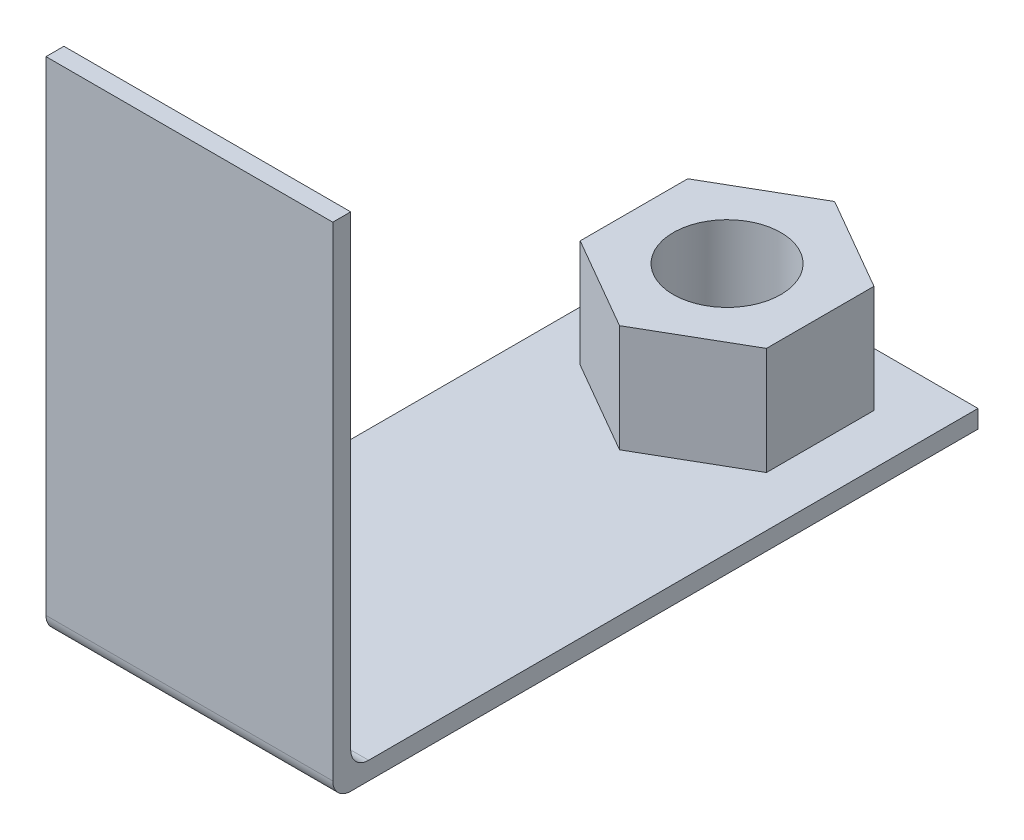
ISO-10303-21;
HEADER;
FILE_DESCRIPTION(('STEP AP214'),'2;1');
FILE_NAME('part.step','',(''),(''),'','','');
FILE_SCHEMA(('AUTOMOTIVE_DESIGN { 1 0 10303 214 1 1 1 1 }'));
ENDSEC;
DATA;
#1=APPLICATION_CONTEXT('core data for automotive mechanical design processes');
#2=APPLICATION_PROTOCOL_DEFINITION('international standard','automotive_design',2000,#1);
#3=PRODUCT_CONTEXT('',#1,'mechanical');
#4=PRODUCT('Part','Part','',(#3));
#5=PRODUCT_RELATED_PRODUCT_CATEGORY('part','',(#4));
#6=PRODUCT_DEFINITION_FORMATION('','',#4);
#7=PRODUCT_DEFINITION_CONTEXT('part definition',#1,'design');
#8=PRODUCT_DEFINITION('design','',#6,#7);
#9=PRODUCT_DEFINITION_SHAPE('','',#8);
#10=(LENGTH_UNIT() NAMED_UNIT(*) SI_UNIT(.MILLI.,.METRE.));
#11=(NAMED_UNIT(*) PLANE_ANGLE_UNIT() SI_UNIT($,.RADIAN.));
#12=(NAMED_UNIT(*) SI_UNIT($,.STERADIAN.) SOLID_ANGLE_UNIT());
#13=UNCERTAINTY_MEASURE_WITH_UNIT(LENGTH_MEASURE(1.E-05),#10,'distance_accuracy_value','');
#14=(GEOMETRIC_REPRESENTATION_CONTEXT(3) GLOBAL_UNCERTAINTY_ASSIGNED_CONTEXT((#13)) GLOBAL_UNIT_ASSIGNED_CONTEXT((#10,
#11,#12)) REPRESENTATION_CONTEXT('',''));
#15=CARTESIAN_POINT('',(0.,0.,0.));
#16=DIRECTION('',(0.,0.,1.));
#17=DIRECTION('',(1.,0.,0.));
#18=AXIS2_PLACEMENT_3D('',#15,#16,#17);
#19=CARTESIAN_POINT('',(4.,14.,-0.499999999999999));
#20=DIRECTION('',(0.,0.,1.));
#21=DIRECTION('',(1.,0.,0.));
#22=AXIS2_PLACEMENT_3D('',#19,#20,#21);
#23=PLANE('',#22);
#24=DIRECTION('',(0.,-1.,0.));
#25=VECTOR('',#24,1.);
#26=CARTESIAN_POINT('',(4.,14.,-0.499999999999999));
#27=LINE('',#26,#25);
#28=CARTESIAN_POINT('',(4.,14.,-0.499999999999999));
#29=VERTEX_POINT('',#28);
#30=CARTESIAN_POINT('',(4.,0.999999999999999,-0.499999999999999));
#31=VERTEX_POINT('',#30);
#32=EDGE_CURVE('E178',#29,#31,#27,.T.);
#33=ORIENTED_EDGE('',*,*,#32,.T.);
#34=DIRECTION('',(-1.,0.,0.));
#35=VECTOR('',#34,1.);
#36=CARTESIAN_POINT('',(-4.,0.999999999999999,-0.499999999999999));
#37=LINE('',#36,#35);
#38=CARTESIAN_POINT('',(-4.,0.999999999999999,-0.499999999999999));
#39=VERTEX_POINT('',#38);
#40=EDGE_CURVE('E217',#31,#39,#37,.T.);
#41=ORIENTED_EDGE('',*,*,#40,.T.);
#42=DIRECTION('',(0.,-1.,0.));
#43=VECTOR('',#42,1.);
#44=CARTESIAN_POINT('',(-4.,14.,-0.499999999999999));
#45=LINE('',#44,#43);
#46=CARTESIAN_POINT('',(-4.,14.,-0.499999999999999));
#47=VERTEX_POINT('',#46);
#48=EDGE_CURVE('E176',#47,#39,#45,.T.);
#49=ORIENTED_EDGE('',*,*,#48,.F.);
#50=DIRECTION('',(-1.,0.,0.));
#51=VECTOR('',#50,1.);
#52=CARTESIAN_POINT('',(4.,14.,-0.499999999999999));
#53=LINE('',#52,#51);
#54=EDGE_CURVE('E171',#29,#47,#53,.T.);
#55=ORIENTED_EDGE('',*,*,#54,.F.);
#56=EDGE_LOOP('',(#33,#41,#49,#55));
#57=FACE_BOUND('',#56,.T.);
#58=CARTESIAN_POINT('',(0.,10.3412824624263,-0.499999999999999));
#59=DIRECTION('',(0.,0.,1.));
#60=DIRECTION('',(1.,0.,0.));
#61=AXIS2_PLACEMENT_3D('',#58,#59,#60);
#62=CIRCLE('',#61,2.83837180414042);
#63=CARTESIAN_POINT('',(2.83837180414042,10.3412824624263,-0.499999999999999));
#64=VERTEX_POINT('',#63);
#65=EDGE_CURVE('E11',#64,#64,#62,.F.);
#66=ORIENTED_EDGE('',*,*,#65,.F.);
#67=EDGE_LOOP('',(#66));
#68=FACE_BOUND('',#67,.T.);
#69=ADVANCED_FACE('F34',(#57,#68),#23,.F.);
#70=CARTESIAN_POINT('',(0.,0.5,0.));
#71=DIRECTION('',(0.,-1.,0.));
#72=DIRECTION('',(0.,0.,-1.));
#73=AXIS2_PLACEMENT_3D('',#70,#71,#72);
#74=PLANE('',#73);
#75=DIRECTION('',(0.,0.,1.));
#76=VECTOR('',#75,1.);
#77=CARTESIAN_POINT('',(-4.,0.5,0.));
#78=LINE('',#77,#76);
#79=CARTESIAN_POINT('',(-4.,0.5,-18.));
#80=VERTEX_POINT('',#79);
#81=CARTESIAN_POINT('',(-4.,0.5,-1.));
#82=VERTEX_POINT('',#81);
#83=EDGE_CURVE('E189',#80,#82,#78,.T.);
#84=ORIENTED_EDGE('',*,*,#83,.T.);
#85=DIRECTION('',(-1.,0.,0.));
#86=VECTOR('',#85,1.);
#87=CARTESIAN_POINT('',(4.,0.5,-1.));
#88=LINE('',#87,#86);
#89=CARTESIAN_POINT('',(4.,0.5,-1.));
#90=VERTEX_POINT('',#89);
#91=EDGE_CURVE('E49',#82,#90,#88,.F.);
#92=ORIENTED_EDGE('',*,*,#91,.T.);
#93=DIRECTION('',(0.,0.,-1.));
#94=VECTOR('',#93,1.);
#95=CARTESIAN_POINT('',(4.,0.5,-18.));
#96=LINE('',#95,#94);
#97=CARTESIAN_POINT('',(4.,0.5,-18.));
#98=VERTEX_POINT('',#97);
#99=EDGE_CURVE('E182',#90,#98,#96,.T.);
#100=ORIENTED_EDGE('',*,*,#99,.T.);
#101=DIRECTION('',(-1.,0.,0.));
#102=VECTOR('',#101,1.);
#103=CARTESIAN_POINT('',(-4.,0.5,-18.));
#104=LINE('',#103,#102);
#105=CARTESIAN_POINT('',(0.,0.5,-18.));
#106=VERTEX_POINT('',#105);
#107=EDGE_CURVE('E186',#98,#106,#104,.T.);
#108=ORIENTED_EDGE('',*,*,#107,.T.);
#109=DIRECTION('',(-0.866025403784441,0.,-0.499999999999995));
#110=VECTOR('',#109,1.);
#111=CARTESIAN_POINT('',(2.5980762113533,0.5,-16.5));
#112=LINE('',#111,#110);
#113=CARTESIAN_POINT('',(2.5980762113533,0.5,-16.5));
#114=VERTEX_POINT('',#113);
#115=EDGE_CURVE('E160',#114,#106,#112,.T.);
#116=ORIENTED_EDGE('',*,*,#115,.F.);
#117=DIRECTION('',(0.,0.,-1.));
#118=VECTOR('',#117,1.);
#119=CARTESIAN_POINT('',(2.59807621135333,0.5,-13.5));
#120=LINE('',#119,#118);
#121=CARTESIAN_POINT('',(2.59807621135333,0.5,-13.5));
#122=VERTEX_POINT('',#121);
#123=EDGE_CURVE('E157',#122,#114,#120,.T.);
#124=ORIENTED_EDGE('',*,*,#123,.F.);
#125=DIRECTION('',(0.866025403784434,0.,-0.500000000000007));
#126=VECTOR('',#125,1.);
#127=CARTESIAN_POINT('',(0.,0.5,-12.));
#128=LINE('',#127,#126);
#129=CARTESIAN_POINT('',(0.,0.5,-12.));
#130=VERTEX_POINT('',#129);
#131=EDGE_CURVE('E457',#130,#122,#128,.T.);
#132=ORIENTED_EDGE('',*,*,#131,.F.);
#133=DIRECTION('',(0.866025403784442,0.,0.499999999999995));
#134=VECTOR('',#133,1.);
#135=CARTESIAN_POINT('',(-2.59807621135331,0.5,-13.5));
#136=LINE('',#135,#134);
#137=CARTESIAN_POINT('',(-2.59807621135331,0.5,-13.5));
#138=VERTEX_POINT('',#137);
#139=EDGE_CURVE('E454',#138,#130,#136,.T.);
#140=ORIENTED_EDGE('',*,*,#139,.F.);
#141=DIRECTION('',(0.,0.,1.));
#142=VECTOR('',#141,1.);
#143=CARTESIAN_POINT('',(-2.59807621135332,0.5,-16.5));
#144=LINE('',#143,#142);
#145=CARTESIAN_POINT('',(-2.59807621135332,0.5,-16.5));
#146=VERTEX_POINT('',#145);
#147=EDGE_CURVE('E451',#146,#138,#144,.T.);
#148=ORIENTED_EDGE('',*,*,#147,.F.);
#149=DIRECTION('',(-0.866025403784438,0.,0.500000000000001));
#150=VECTOR('',#149,1.);
#151=CARTESIAN_POINT('',(0.,0.5,-18.));
#152=LINE('',#151,#150);
#153=EDGE_CURVE('E449',#106,#146,#152,.T.);
#154=ORIENTED_EDGE('',*,*,#153,.F.);
#155=EDGE_CURVE('E184',#106,#80,#104,.T.);
#156=ORIENTED_EDGE('',*,*,#155,.T.);
#157=EDGE_LOOP('',(#84,#92,#100,#108,#116,#124,#132,#140,#148,#154,#156));
#158=FACE_BOUND('',#157,.T.);
#159=ADVANCED_FACE('F246',(#158),#74,.F.);
#160=CARTESIAN_POINT('',(4.,0.5,-18.));
#161=DIRECTION('',(-1.,0.,0.));
#162=DIRECTION('',(0.,0.,1.));
#163=AXIS2_PLACEMENT_3D('',#160,#161,#162);
#164=PLANE('',#163);
#165=DIRECTION('',(0.,-1.,0.));
#166=VECTOR('',#165,1.);
#167=CARTESIAN_POINT('',(4.,0.5,0.));
#168=LINE('',#167,#166);
#169=CARTESIAN_POINT('',(4.,14.,0.));
#170=VERTEX_POINT('',#169);
#171=CARTESIAN_POINT('',(4.,0.5,0.));
#172=VERTEX_POINT('',#171);
#173=EDGE_CURVE('E205',#170,#172,#168,.T.);
#174=ORIENTED_EDGE('',*,*,#173,.T.);
#175=CARTESIAN_POINT('',(4.,0.5,-0.500000000000001));
#176=DIRECTION('',(-1.,0.,0.));
#177=DIRECTION('',(0.,0.,1.));
#178=AXIS2_PLACEMENT_3D('',#175,#176,#177);
#179=CIRCLE('',#178,0.5);
#180=CARTESIAN_POINT('',(4.,0.,-0.5));
#181=VERTEX_POINT('',#180);
#182=EDGE_CURVE('E211',#172,#181,#179,.F.);
#183=ORIENTED_EDGE('',*,*,#182,.T.);
#184=DIRECTION('',(0.,0.,-1.));
#185=VECTOR('',#184,1.);
#186=CARTESIAN_POINT('',(4.,0.,-18.));
#187=LINE('',#186,#185);
#188=CARTESIAN_POINT('',(4.,0.,-18.));
#189=VERTEX_POINT('',#188);
#190=EDGE_CURVE('E181',#181,#189,#187,.T.);
#191=ORIENTED_EDGE('',*,*,#190,.T.);
#192=DIRECTION('',(0.,-1.,0.));
#193=VECTOR('',#192,1.);
#194=CARTESIAN_POINT('',(4.,0.5,-18.));
#195=LINE('',#194,#193);
#196=EDGE_CURVE('E202',#98,#189,#195,.T.);
#197=ORIENTED_EDGE('',*,*,#196,.F.);
#198=ORIENTED_EDGE('',*,*,#99,.F.);
#199=CARTESIAN_POINT('',(4.,0.999999999999999,-1.));
#200=DIRECTION('',(-1.,0.,0.));
#201=DIRECTION('',(0.,0.,1.));
#202=AXIS2_PLACEMENT_3D('',#199,#200,#201);
#203=CIRCLE('',#202,0.5);
#204=EDGE_CURVE('E42',#90,#31,#203,.T.);
#205=ORIENTED_EDGE('',*,*,#204,.T.);
#206=ORIENTED_EDGE('',*,*,#32,.F.);
#207=DIRECTION('',(0.,0.,-1.));
#208=VECTOR('',#207,1.);
#209=CARTESIAN_POINT('',(4.,14.,0.));
#210=LINE('',#209,#208);
#211=EDGE_CURVE('E164',#170,#29,#210,.T.);
#212=ORIENTED_EDGE('',*,*,#211,.F.);
#213=EDGE_LOOP('',(#174,#183,#191,#197,#198,#205,#206,#212));
#214=FACE_BOUND('',#213,.T.);
#215=ADVANCED_FACE('F224',(#214),#164,.F.);
#216=CARTESIAN_POINT('',(-4.,0.5,-18.));
#217=DIRECTION('',(0.,0.,1.));
#218=DIRECTION('',(1.,0.,0.));
#219=AXIS2_PLACEMENT_3D('',#216,#217,#218);
#220=PLANE('',#219);
#221=DIRECTION('',(-1.,0.,0.));
#222=VECTOR('',#221,1.);
#223=CARTESIAN_POINT('',(-4.,0.,-18.));
#224=LINE('',#223,#222);
#225=CARTESIAN_POINT('',(-4.,0.,-18.));
#226=VERTEX_POINT('',#225);
#227=EDGE_CURVE('E193',#189,#226,#224,.T.);
#228=ORIENTED_EDGE('',*,*,#227,.T.);
#229=DIRECTION('',(0.,-1.,0.));
#230=VECTOR('',#229,1.);
#231=CARTESIAN_POINT('',(-4.,0.5,-18.));
#232=LINE('',#231,#230);
#233=EDGE_CURVE('E199',#80,#226,#232,.T.);
#234=ORIENTED_EDGE('',*,*,#233,.F.);
#235=ORIENTED_EDGE('',*,*,#155,.F.);
#236=ORIENTED_EDGE('',*,*,#107,.F.);
#237=ORIENTED_EDGE('',*,*,#196,.T.);
#238=EDGE_LOOP('',(#228,#234,#235,#236,#237));
#239=FACE_BOUND('',#238,.T.);
#240=ADVANCED_FACE('F267',(#239),#220,.F.);
#241=CARTESIAN_POINT('',(-4.,0.5,0.));
#242=DIRECTION('',(1.,0.,0.));
#243=DIRECTION('',(0.,0.,-1.));
#244=AXIS2_PLACEMENT_3D('',#241,#242,#243);
#245=PLANE('',#244);
#246=DIRECTION('',(0.,0.,1.));
#247=VECTOR('',#246,1.);
#248=CARTESIAN_POINT('',(-4.,0.,0.));
#249=LINE('',#248,#247);
#250=CARTESIAN_POINT('',(-4.,0.,-0.499999999999999));
#251=VERTEX_POINT('',#250);
#252=EDGE_CURVE('E185',#226,#251,#249,.T.);
#253=ORIENTED_EDGE('',*,*,#252,.T.);
#254=CARTESIAN_POINT('',(-4.,0.5,-0.499999999999999));
#255=DIRECTION('',(1.,0.,0.));
#256=DIRECTION('',(0.,0.,-1.));
#257=AXIS2_PLACEMENT_3D('',#254,#255,#256);
#258=CIRCLE('',#257,0.5);
#259=CARTESIAN_POINT('',(-4.,0.5,0.));
#260=VERTEX_POINT('',#259);
#261=EDGE_CURVE('E215',#251,#260,#258,.F.);
#262=ORIENTED_EDGE('',*,*,#261,.T.);
#263=DIRECTION('',(0.,-1.,0.));
#264=VECTOR('',#263,1.);
#265=CARTESIAN_POINT('',(-4.,0.5,0.));
#266=LINE('',#265,#264);
#267=CARTESIAN_POINT('',(-4.,14.,0.));
#268=VERTEX_POINT('',#267);
#269=EDGE_CURVE('E191',#268,#260,#266,.T.);
#270=ORIENTED_EDGE('',*,*,#269,.F.);
#271=DIRECTION('',(0.,0.,1.));
#272=VECTOR('',#271,1.);
#273=CARTESIAN_POINT('',(-4.,14.,0.));
#274=LINE('',#273,#272);
#275=EDGE_CURVE('E173',#47,#268,#274,.T.);
#276=ORIENTED_EDGE('',*,*,#275,.F.);
#277=ORIENTED_EDGE('',*,*,#48,.T.);
#278=CARTESIAN_POINT('',(-4.,0.999999999999999,-1.));
#279=DIRECTION('',(1.,0.,0.));
#280=DIRECTION('',(0.,0.,-1.));
#281=AXIS2_PLACEMENT_3D('',#278,#279,#280);
#282=CIRCLE('',#281,0.5);
#283=EDGE_CURVE('E57',#39,#82,#282,.T.);
#284=ORIENTED_EDGE('',*,*,#283,.T.);
#285=ORIENTED_EDGE('',*,*,#83,.F.);
#286=ORIENTED_EDGE('',*,*,#233,.T.);
#287=EDGE_LOOP('',(#253,#262,#270,#276,#277,#284,#285,#286));
#288=FACE_BOUND('',#287,.T.);
#289=ADVANCED_FACE('F263',(#288),#245,.F.);
#290=CARTESIAN_POINT('',(0.,0.5,0.));
#291=DIRECTION('',(0.,0.,-1.));
#292=DIRECTION('',(-1.,0.,0.));
#293=AXIS2_PLACEMENT_3D('',#290,#291,#292);
#294=PLANE('',#293);
#295=ORIENTED_EDGE('',*,*,#269,.T.);
#296=DIRECTION('',(1.,0.,0.));
#297=VECTOR('',#296,1.);
#298=CARTESIAN_POINT('',(4.,0.5,0.));
#299=LINE('',#298,#297);
#300=EDGE_CURVE('E208',#260,#172,#299,.T.);
#301=ORIENTED_EDGE('',*,*,#300,.T.);
#302=ORIENTED_EDGE('',*,*,#173,.F.);
#303=DIRECTION('',(1.,0.,0.));
#304=VECTOR('',#303,1.);
#305=CARTESIAN_POINT('',(-4.,14.,0.));
#306=LINE('',#305,#304);
#307=EDGE_CURVE('E161',#268,#170,#306,.T.);
#308=ORIENTED_EDGE('',*,*,#307,.F.);
#309=EDGE_LOOP('',(#295,#301,#302,#308));
#310=FACE_BOUND('',#309,.T.);
#311=ADVANCED_FACE('F259',(#310),#294,.F.);
#312=CARTESIAN_POINT('',(0.,0.,0.));
#313=DIRECTION('',(0.,-1.,0.));
#314=DIRECTION('',(0.,0.,-1.));
#315=AXIS2_PLACEMENT_3D('',#312,#313,#314);
#316=PLANE('',#315);
#317=CARTESIAN_POINT('',(0.,0.,-15.));
#318=DIRECTION('',(0.,-1.,0.));
#319=DIRECTION('',(0.,0.,-1.));
#320=AXIS2_PLACEMENT_3D('',#317,#318,#319);
#321=CIRCLE('',#320,1.5);
#322=CARTESIAN_POINT('',(0.,0.,-16.5));
#323=VERTEX_POINT('',#322);
#324=EDGE_CURVE('E436',#323,#323,#321,.T.);
#325=ORIENTED_EDGE('',*,*,#324,.F.);
#326=EDGE_LOOP('',(#325));
#327=FACE_BOUND('',#326,.T.);
#328=ORIENTED_EDGE('',*,*,#190,.F.);
#329=DIRECTION('',(1.,0.,0.));
#330=VECTOR('',#329,1.);
#331=CARTESIAN_POINT('',(-4.,0.,-0.499999999999999));
#332=LINE('',#331,#330);
#333=EDGE_CURVE('E213',#181,#251,#332,.F.);
#334=ORIENTED_EDGE('',*,*,#333,.T.);
#335=ORIENTED_EDGE('',*,*,#252,.F.);
#336=ORIENTED_EDGE('',*,*,#227,.F.);
#337=EDGE_LOOP('',(#328,#334,#335,#336));
#338=FACE_BOUND('',#337,.T.);
#339=ADVANCED_FACE('F256',(#327,#338),#316,.T.);
#340=CARTESIAN_POINT('',(0.,14.,0.));
#341=DIRECTION('',(0.,1.,0.));
#342=DIRECTION('',(0.,0.,1.));
#343=AXIS2_PLACEMENT_3D('',#340,#341,#342);
#344=PLANE('',#343);
#345=ORIENTED_EDGE('',*,*,#307,.T.);
#346=ORIENTED_EDGE('',*,*,#211,.T.);
#347=ORIENTED_EDGE('',*,*,#54,.T.);
#348=ORIENTED_EDGE('',*,*,#275,.T.);
#349=EDGE_LOOP('',(#345,#346,#347,#348));
#350=FACE_BOUND('',#349,.T.);
#351=ADVANCED_FACE('F253',(#350),#344,.T.);
#352=CARTESIAN_POINT('',(2.5980762113533,3.5,-16.5));
#353=DIRECTION('',(-0.499999999999995,0.,0.866025403784441));
#354=DIRECTION('',(0.866025403784441,0.,0.499999999999995));
#355=AXIS2_PLACEMENT_3D('',#352,#353,#354);
#356=PLANE('',#355);
#357=ORIENTED_EDGE('',*,*,#115,.T.);
#358=DIRECTION('',(0.,-1.,0.));
#359=VECTOR('',#358,1.);
#360=CARTESIAN_POINT('',(0.,3.5,-18.));
#361=LINE('',#360,#359);
#362=CARTESIAN_POINT('',(0.,3.5,-18.));
#363=VERTEX_POINT('',#362);
#364=EDGE_CURVE('E141',#363,#106,#361,.T.);
#365=ORIENTED_EDGE('',*,*,#364,.F.);
#366=DIRECTION('',(-0.866025403784441,0.,-0.499999999999995));
#367=VECTOR('',#366,1.);
#368=CARTESIAN_POINT('',(2.5980762113533,3.5,-16.5));
#369=LINE('',#368,#367);
#370=CARTESIAN_POINT('',(2.5980762113533,3.5,-16.5));
#371=VERTEX_POINT('',#370);
#372=EDGE_CURVE('E148',#371,#363,#369,.T.);
#373=ORIENTED_EDGE('',*,*,#372,.F.);
#374=DIRECTION('',(0.,-1.,0.));
#375=VECTOR('',#374,1.);
#376=CARTESIAN_POINT('',(2.5980762113533,3.5,-16.5));
#377=LINE('',#376,#375);
#378=EDGE_CURVE('E447',#371,#114,#377,.T.);
#379=ORIENTED_EDGE('',*,*,#378,.T.);
#380=EDGE_LOOP('',(#357,#365,#373,#379));
#381=FACE_BOUND('',#380,.T.);
#382=ADVANCED_FACE('F159',(#381),#356,.F.);
#383=CARTESIAN_POINT('',(0.,3.5,-18.));
#384=DIRECTION('',(0.500000000000001,0.,0.866025403784438));
#385=DIRECTION('',(0.866025403784438,0.,-0.500000000000001));
#386=AXIS2_PLACEMENT_3D('',#383,#384,#385);
#387=PLANE('',#386);
#388=ORIENTED_EDGE('',*,*,#153,.T.);
#389=DIRECTION('',(0.,-1.,0.));
#390=VECTOR('',#389,1.);
#391=CARTESIAN_POINT('',(-2.59807621135332,3.5,-16.5));
#392=LINE('',#391,#390);
#393=CARTESIAN_POINT('',(-2.59807621135332,3.5,-16.5));
#394=VERTEX_POINT('',#393);
#395=EDGE_CURVE('E144',#394,#146,#392,.T.);
#396=ORIENTED_EDGE('',*,*,#395,.F.);
#397=DIRECTION('',(-0.866025403784438,0.,0.500000000000001));
#398=VECTOR('',#397,1.);
#399=CARTESIAN_POINT('',(0.,3.5,-18.));
#400=LINE('',#399,#398);
#401=EDGE_CURVE('E136',#363,#394,#400,.T.);
#402=ORIENTED_EDGE('',*,*,#401,.F.);
#403=ORIENTED_EDGE('',*,*,#364,.T.);
#404=EDGE_LOOP('',(#388,#396,#402,#403));
#405=FACE_BOUND('',#404,.T.);
#406=ADVANCED_FACE('F139',(#405),#387,.F.);
#407=CARTESIAN_POINT('',(-2.59807621135332,3.5,-16.5));
#408=DIRECTION('',(1.,0.,0.));
#409=DIRECTION('',(0.,0.,-1.));
#410=AXIS2_PLACEMENT_3D('',#407,#408,#409);
#411=PLANE('',#410);
#412=ORIENTED_EDGE('',*,*,#147,.T.);
#413=DIRECTION('',(0.,-1.,0.));
#414=VECTOR('',#413,1.);
#415=CARTESIAN_POINT('',(-2.59807621135331,3.5,-13.5));
#416=LINE('',#415,#414);
#417=CARTESIAN_POINT('',(-2.59807621135331,3.5,-13.5));
#418=VERTEX_POINT('',#417);
#419=EDGE_CURVE('E166',#418,#138,#416,.T.);
#420=ORIENTED_EDGE('',*,*,#419,.F.);
#421=DIRECTION('',(0.,0.,1.));
#422=VECTOR('',#421,1.);
#423=CARTESIAN_POINT('',(-2.59807621135332,3.5,-16.5));
#424=LINE('',#423,#422);
#425=EDGE_CURVE('E147',#394,#418,#424,.T.);
#426=ORIENTED_EDGE('',*,*,#425,.F.);
#427=ORIENTED_EDGE('',*,*,#395,.T.);
#428=EDGE_LOOP('',(#412,#420,#426,#427));
#429=FACE_BOUND('',#428,.T.);
#430=ADVANCED_FACE('F311',(#429),#411,.F.);
#431=CARTESIAN_POINT('',(-2.59807621135331,3.5,-13.5));
#432=DIRECTION('',(0.499999999999995,0.,-0.866025403784441));
#433=DIRECTION('',(-0.866025403784442,0.,-0.499999999999995));
#434=AXIS2_PLACEMENT_3D('',#431,#432,#433);
#435=PLANE('',#434);
#436=ORIENTED_EDGE('',*,*,#139,.T.);
#437=DIRECTION('',(0.,-1.,0.));
#438=VECTOR('',#437,1.);
#439=CARTESIAN_POINT('',(0.,3.5,-12.));
#440=LINE('',#439,#438);
#441=CARTESIAN_POINT('',(0.,3.5,-12.));
#442=VERTEX_POINT('',#441);
#443=EDGE_CURVE('E466',#442,#130,#440,.T.);
#444=ORIENTED_EDGE('',*,*,#443,.F.);
#445=DIRECTION('',(0.866025403784442,0.,0.499999999999995));
#446=VECTOR('',#445,1.);
#447=CARTESIAN_POINT('',(-2.59807621135331,3.5,-13.5));
#448=LINE('',#447,#446);
#449=EDGE_CURVE('E442',#418,#442,#448,.T.);
#450=ORIENTED_EDGE('',*,*,#449,.F.);
#451=ORIENTED_EDGE('',*,*,#419,.T.);
#452=EDGE_LOOP('',(#436,#444,#450,#451));
#453=FACE_BOUND('',#452,.T.);
#454=ADVANCED_FACE('F318',(#453),#435,.F.);
#455=CARTESIAN_POINT('',(0.,3.5,-12.));
#456=DIRECTION('',(-0.500000000000007,0.,-0.866025403784434));
#457=DIRECTION('',(-0.866025403784435,0.,0.500000000000007));
#458=AXIS2_PLACEMENT_3D('',#455,#456,#457);
#459=PLANE('',#458);
#460=ORIENTED_EDGE('',*,*,#131,.T.);
#461=DIRECTION('',(0.,-1.,0.));
#462=VECTOR('',#461,1.);
#463=CARTESIAN_POINT('',(2.59807621135333,3.5,-13.5));
#464=LINE('',#463,#462);
#465=CARTESIAN_POINT('',(2.59807621135333,3.5,-13.5));
#466=VERTEX_POINT('',#465);
#467=EDGE_CURVE('E463',#466,#122,#464,.T.);
#468=ORIENTED_EDGE('',*,*,#467,.F.);
#469=DIRECTION('',(0.866025403784434,0.,-0.500000000000007));
#470=VECTOR('',#469,1.);
#471=CARTESIAN_POINT('',(0.,3.5,-12.));
#472=LINE('',#471,#470);
#473=EDGE_CURVE('E444',#442,#466,#472,.T.);
#474=ORIENTED_EDGE('',*,*,#473,.F.);
#475=ORIENTED_EDGE('',*,*,#443,.T.);
#476=EDGE_LOOP('',(#460,#468,#474,#475));
#477=FACE_BOUND('',#476,.T.);
#478=ADVANCED_FACE('F326',(#477),#459,.F.);
#479=CARTESIAN_POINT('',(2.59807621135333,3.5,-13.5));
#480=DIRECTION('',(-1.,0.,0.));
#481=DIRECTION('',(0.,0.,1.));
#482=AXIS2_PLACEMENT_3D('',#479,#480,#481);
#483=PLANE('',#482);
#484=ORIENTED_EDGE('',*,*,#123,.T.);
#485=ORIENTED_EDGE('',*,*,#378,.F.);
#486=DIRECTION('',(0.,0.,-1.));
#487=VECTOR('',#486,1.);
#488=CARTESIAN_POINT('',(2.59807621135333,3.5,-13.5));
#489=LINE('',#488,#487);
#490=EDGE_CURVE('E153',#466,#371,#489,.T.);
#491=ORIENTED_EDGE('',*,*,#490,.F.);
#492=ORIENTED_EDGE('',*,*,#467,.T.);
#493=EDGE_LOOP('',(#484,#485,#491,#492));
#494=FACE_BOUND('',#493,.T.);
#495=ADVANCED_FACE('F334',(#494),#483,.F.);
#496=CARTESIAN_POINT('',(0.,3.5,0.));
#497=DIRECTION('',(0.,1.,0.));
#498=DIRECTION('',(0.,0.,1.));
#499=AXIS2_PLACEMENT_3D('',#496,#497,#498);
#500=PLANE('',#499);
#501=CARTESIAN_POINT('',(0.,3.5,-15.));
#502=DIRECTION('',(0.,1.,0.));
#503=DIRECTION('',(0.,0.,1.));
#504=AXIS2_PLACEMENT_3D('',#501,#502,#503);
#505=CIRCLE('',#504,1.5);
#506=CARTESIAN_POINT('',(0.,3.5,-13.5));
#507=VERTEX_POINT('',#506);
#508=EDGE_CURVE('E433',#507,#507,#505,.T.);
#509=ORIENTED_EDGE('',*,*,#508,.F.);
#510=EDGE_LOOP('',(#509));
#511=FACE_BOUND('',#510,.T.);
#512=ORIENTED_EDGE('',*,*,#372,.T.);
#513=ORIENTED_EDGE('',*,*,#401,.T.);
#514=ORIENTED_EDGE('',*,*,#425,.T.);
#515=ORIENTED_EDGE('',*,*,#449,.T.);
#516=ORIENTED_EDGE('',*,*,#473,.T.);
#517=ORIENTED_EDGE('',*,*,#490,.T.);
#518=EDGE_LOOP('',(#512,#513,#514,#515,#516,#517));
#519=FACE_BOUND('',#518,.T.);
#520=ADVANCED_FACE('F151',(#511,#519),#500,.T.);
#521=CARTESIAN_POINT('',(0.,-9.5,-15.));
#522=DIRECTION('',(0.,1.,0.));
#523=DIRECTION('',(0.,0.,1.));
#524=AXIS2_PLACEMENT_3D('',#521,#522,#523);
#525=CYLINDRICAL_SURFACE('',#524,1.5);
#526=ORIENTED_EDGE('',*,*,#324,.T.);
#527=EDGE_LOOP('',(#526));
#528=FACE_BOUND('',#527,.T.);
#529=ORIENTED_EDGE('',*,*,#508,.T.);
#530=EDGE_LOOP('',(#529));
#531=FACE_BOUND('',#530,.T.);
#532=ADVANCED_FACE('F243',(#528,#531),#525,.F.);
#533=CARTESIAN_POINT('',(0.,0.5,-0.5));
#534=DIRECTION('',(-1.,0.,0.));
#535=DIRECTION('',(0.,0.,1.));
#536=AXIS2_PLACEMENT_3D('',#533,#534,#535);
#537=CYLINDRICAL_SURFACE('',#536,0.5);
#538=ORIENTED_EDGE('',*,*,#261,.F.);
#539=ORIENTED_EDGE('',*,*,#333,.F.);
#540=ORIENTED_EDGE('',*,*,#182,.F.);
#541=ORIENTED_EDGE('',*,*,#300,.F.);
#542=EDGE_LOOP('',(#538,#539,#540,#541));
#543=FACE_BOUND('',#542,.T.);
#544=ADVANCED_FACE('F235',(#543),#537,.T.);
#545=CARTESIAN_POINT('',(4.,0.999999999999999,-1.));
#546=DIRECTION('',(1.,0.,0.));
#547=DIRECTION('',(0.,0.,-1.));
#548=AXIS2_PLACEMENT_3D('',#545,#546,#547);
#549=CYLINDRICAL_SURFACE('',#548,0.5);
#550=ORIENTED_EDGE('',*,*,#204,.F.);
#551=ORIENTED_EDGE('',*,*,#91,.F.);
#552=ORIENTED_EDGE('',*,*,#283,.F.);
#553=ORIENTED_EDGE('',*,*,#40,.F.);
#554=EDGE_LOOP('',(#550,#551,#552,#553));
#555=FACE_BOUND('',#554,.T.);
#556=ADVANCED_FACE('F36',(#555),#549,.F.);
#557=CARTESIAN_POINT('',(0.,10.3412824624263,-0.799999999999999));
#558=DIRECTION('',(0.,0.,1.));
#559=DIRECTION('',(1.,0.,0.));
#560=AXIS2_PLACEMENT_3D('',#557,#558,#559);
#561=CYLINDRICAL_SURFACE('',#560,2.83837180414042);
#562=CARTESIAN_POINT('',(0.,10.3412824624263,-0.799999999999999));
#563=DIRECTION('',(0.,0.,-1.));
#564=DIRECTION('',(-1.,0.,0.));
#565=AXIS2_PLACEMENT_3D('',#562,#563,#564);
#566=CIRCLE('',#565,2.83837180414042);
#567=CARTESIAN_POINT('',(-2.83837180414042,10.3412824624263,-0.799999999999999));
#568=VERTEX_POINT('',#567);
#569=EDGE_CURVE('E432',#568,#568,#566,.T.);
#570=ORIENTED_EDGE('',*,*,#569,.F.);
#571=EDGE_LOOP('',(#570));
#572=FACE_BOUND('',#571,.T.);
#573=ORIENTED_EDGE('',*,*,#65,.T.);
#574=EDGE_LOOP('',(#573));
#575=FACE_BOUND('',#574,.T.);
#576=ADVANCED_FACE('F234',(#572,#575),#561,.T.);
#577=CARTESIAN_POINT('',(0.,10.3412824624263,-0.799999999999999));
#578=DIRECTION('',(0.,0.,-1.));
#579=DIRECTION('',(-1.,0.,0.));
#580=AXIS2_PLACEMENT_3D('',#577,#578,#579);
#581=PLANE('',#580);
#582=ORIENTED_EDGE('',*,*,#569,.T.);
#583=EDGE_LOOP('',(#582));
#584=FACE_BOUND('',#583,.T.);
#585=ADVANCED_FACE('F240',(#584),#581,.T.);
#586=CLOSED_SHELL('',(#69,#159,#215,#240,#289,#311,#339,#351,#382,#406,#430,#454,#478,#495,#520,
#532,#544,#556,#576,#585));
#587=MANIFOLD_SOLID_BREP('B2',#586);
#588=ADVANCED_BREP_SHAPE_REPRESENTATION('',(#18,#587),#14);
#589=SHAPE_DEFINITION_REPRESENTATION(#9,#588);
ENDSEC;
END-ISO-10303-21;
